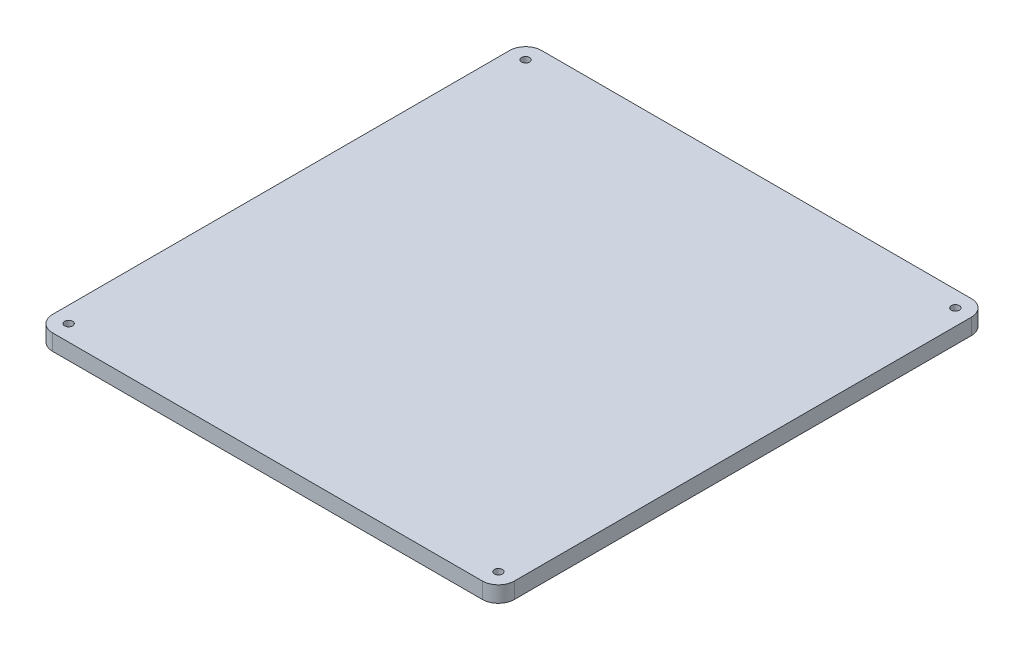
ISO-10303-21;
HEADER;
FILE_DESCRIPTION(('STEP AP214'),'2;1');
FILE_NAME('part.step','',(''),(''),'','','');
FILE_SCHEMA(('AUTOMOTIVE_DESIGN { 1 0 10303 214 1 1 1 1 }'));
ENDSEC;
DATA;
#1=APPLICATION_CONTEXT('core data for automotive mechanical design processes');
#2=APPLICATION_PROTOCOL_DEFINITION('international standard','automotive_design',2000,#1);
#3=PRODUCT_CONTEXT('',#1,'mechanical');
#4=PRODUCT('Part','Part','',(#3));
#5=PRODUCT_RELATED_PRODUCT_CATEGORY('part','',(#4));
#6=PRODUCT_DEFINITION_FORMATION('','',#4);
#7=PRODUCT_DEFINITION_CONTEXT('part definition',#1,'design');
#8=PRODUCT_DEFINITION('design','',#6,#7);
#9=PRODUCT_DEFINITION_SHAPE('','',#8);
#10=(LENGTH_UNIT() NAMED_UNIT(*) SI_UNIT(.MILLI.,.METRE.));
#11=(NAMED_UNIT(*) PLANE_ANGLE_UNIT() SI_UNIT($,.RADIAN.));
#12=(NAMED_UNIT(*) SI_UNIT($,.STERADIAN.) SOLID_ANGLE_UNIT());
#13=UNCERTAINTY_MEASURE_WITH_UNIT(LENGTH_MEASURE(1.E-05),#10,'distance_accuracy_value','');
#14=(GEOMETRIC_REPRESENTATION_CONTEXT(3) GLOBAL_UNCERTAINTY_ASSIGNED_CONTEXT((#13)) GLOBAL_UNIT_ASSIGNED_CONTEXT((#10,
#11,#12)) REPRESENTATION_CONTEXT('',''));
#15=CARTESIAN_POINT('',(0.,0.,0.));
#16=DIRECTION('',(0.,0.,1.));
#17=DIRECTION('',(1.,0.,0.));
#18=AXIS2_PLACEMENT_3D('',#15,#16,#17);
#19=CARTESIAN_POINT('',(0.,10.,0.));
#20=DIRECTION('',(0.,1.,0.));
#21=DIRECTION('',(0.,0.,1.));
#22=AXIS2_PLACEMENT_3D('',#19,#20,#21);
#23=PLANE('',#22);
#24=CARTESIAN_POINT('',(212.300909569802,10.,238.344317293603));
#25=DIRECTION('',(0.,1.,0.));
#26=DIRECTION('',(0.,0.,1.));
#27=AXIS2_PLACEMENT_3D('',#24,#25,#26);
#28=CIRCLE('',#27,2.4999999999989);
#29=CARTESIAN_POINT('',(212.300909569802,10.,240.844317293601));
#30=VERTEX_POINT('',#29);
#31=EDGE_CURVE('E186',#30,#30,#28,.T.);
#32=ORIENTED_EDGE('',*,*,#31,.F.);
#33=EDGE_LOOP('',(#32));
#34=FACE_BOUND('',#33,.T.);
#35=CARTESIAN_POINT('',(-55.6990904301984,10.,-46.6556827063974));
#36=DIRECTION('',(0.,1.,0.));
#37=DIRECTION('',(0.,0.,1.));
#38=AXIS2_PLACEMENT_3D('',#35,#36,#37);
#39=CIRCLE('',#38,2.50000000002064);
#40=CARTESIAN_POINT('',(-55.6990904301984,10.,-44.1556827063768));
#41=VERTEX_POINT('',#40);
#42=EDGE_CURVE('E132',#41,#41,#39,.T.);
#43=ORIENTED_EDGE('',*,*,#42,.F.);
#44=EDGE_LOOP('',(#43));
#45=FACE_BOUND('',#44,.T.);
#46=DIRECTION('',(0.,0.,1.));
#47=VECTOR('',#46,1.);
#48=CARTESIAN_POINT('',(-65.6990904301984,10.,-56.6556827063974));
#49=LINE('',#48,#47);
#50=CARTESIAN_POINT('',(-65.6990904301984,10.,-46.6556827063974));
#51=VERTEX_POINT('',#50);
#52=CARTESIAN_POINT('',(-65.6990904301984,10.,238.344317293603));
#53=VERTEX_POINT('',#52);
#54=EDGE_CURVE('E137',#51,#53,#49,.T.);
#55=ORIENTED_EDGE('',*,*,#54,.T.);
#56=CARTESIAN_POINT('',(-55.6990904301984,10.,238.344317293604));
#57=DIRECTION('',(0.,1.,0.));
#58=DIRECTION('',(0.,0.,1.));
#59=AXIS2_PLACEMENT_3D('',#56,#57,#58);
#60=CIRCLE('',#59,10.);
#61=CARTESIAN_POINT('',(-55.6990904301984,10.,248.344317293604));
#62=VERTEX_POINT('',#61);
#63=EDGE_CURVE('E152',#53,#62,#60,.T.);
#64=ORIENTED_EDGE('',*,*,#63,.T.);
#65=DIRECTION('',(1.,0.,0.));
#66=VECTOR('',#65,1.);
#67=CARTESIAN_POINT('',(-65.6990904301984,10.,248.344317293604));
#68=LINE('',#67,#66);
#69=CARTESIAN_POINT('',(212.300909569802,10.,248.344317293603));
#70=VERTEX_POINT('',#69);
#71=EDGE_CURVE('E119',#62,#70,#68,.T.);
#72=ORIENTED_EDGE('',*,*,#71,.T.);
#73=CARTESIAN_POINT('',(212.300909569802,10.,238.344317293603));
#74=DIRECTION('',(0.,1.,0.));
#75=DIRECTION('',(0.,0.,1.));
#76=AXIS2_PLACEMENT_3D('',#73,#74,#75);
#77=CIRCLE('',#76,10.);
#78=CARTESIAN_POINT('',(222.300909569802,10.,238.344317293603));
#79=VERTEX_POINT('',#78);
#80=EDGE_CURVE('E150',#70,#79,#77,.T.);
#81=ORIENTED_EDGE('',*,*,#80,.T.);
#82=DIRECTION('',(0.,0.,-1.));
#83=VECTOR('',#82,1.);
#84=CARTESIAN_POINT('',(222.300909569802,10.,-56.6556827063974));
#85=LINE('',#84,#83);
#86=CARTESIAN_POINT('',(222.300909569802,10.,-46.6556827063974));
#87=VERTEX_POINT('',#86);
#88=EDGE_CURVE('E163',#79,#87,#85,.T.);
#89=ORIENTED_EDGE('',*,*,#88,.T.);
#90=CARTESIAN_POINT('',(212.300909569802,10.,-46.6556827063974));
#91=DIRECTION('',(0.,1.,0.));
#92=DIRECTION('',(0.,0.,1.));
#93=AXIS2_PLACEMENT_3D('',#90,#91,#92);
#94=CIRCLE('',#93,10.);
#95=CARTESIAN_POINT('',(212.300909569802,10.,-56.6556827063974));
#96=VERTEX_POINT('',#95);
#97=EDGE_CURVE('E54',#87,#96,#94,.T.);
#98=ORIENTED_EDGE('',*,*,#97,.T.);
#99=DIRECTION('',(-1.,0.,0.));
#100=VECTOR('',#99,1.);
#101=CARTESIAN_POINT('',(-65.6990904301984,10.,-56.6556827063974));
#102=LINE('',#101,#100);
#103=CARTESIAN_POINT('',(-55.6990904301984,10.,-56.6556827063974));
#104=VERTEX_POINT('',#103);
#105=EDGE_CURVE('E138',#96,#104,#102,.T.);
#106=ORIENTED_EDGE('',*,*,#105,.T.);
#107=CARTESIAN_POINT('',(-55.6990904301984,10.,-46.6556827063974));
#108=DIRECTION('',(0.,1.,0.));
#109=DIRECTION('',(0.,0.,1.));
#110=AXIS2_PLACEMENT_3D('',#107,#108,#109);
#111=CIRCLE('',#110,10.);
#112=EDGE_CURVE('E147',#104,#51,#111,.T.);
#113=ORIENTED_EDGE('',*,*,#112,.T.);
#114=EDGE_LOOP('',(#55,#64,#72,#81,#89,#98,#106,#113));
#115=FACE_BOUND('',#114,.T.);
#116=CARTESIAN_POINT('',(212.300909569802,10.,-46.6556827063974));
#117=DIRECTION('',(0.,1.,0.));
#118=DIRECTION('',(0.,0.,-1.));
#119=AXIS2_PLACEMENT_3D('',#116,#117,#118);
#120=CIRCLE('',#119,2.50000000002066);
#121=CARTESIAN_POINT('',(212.300909569802,10.,-49.1556827064181));
#122=VERTEX_POINT('',#121);
#123=EDGE_CURVE('E180',#122,#122,#120,.T.);
#124=ORIENTED_EDGE('',*,*,#123,.F.);
#125=EDGE_LOOP('',(#124));
#126=FACE_BOUND('',#125,.T.);
#127=CARTESIAN_POINT('',(-55.6990904301984,10.,238.344317293603));
#128=DIRECTION('',(0.,1.,0.));
#129=DIRECTION('',(0.,0.,-1.));
#130=AXIS2_PLACEMENT_3D('',#127,#128,#129);
#131=CIRCLE('',#130,2.49999999999888);
#132=CARTESIAN_POINT('',(-55.6990904301984,10.,235.844317293604));
#133=VERTEX_POINT('',#132);
#134=EDGE_CURVE('E192',#133,#133,#131,.T.);
#135=ORIENTED_EDGE('',*,*,#134,.F.);
#136=EDGE_LOOP('',(#135));
#137=FACE_BOUND('',#136,.T.);
#138=ADVANCED_FACE('F33',(#34,#45,#115,#126,#137),#23,.T.);
#139=CARTESIAN_POINT('',(0.,0.,0.));
#140=DIRECTION('',(0.,1.,0.));
#141=DIRECTION('',(0.,0.,1.));
#142=AXIS2_PLACEMENT_3D('',#139,#140,#141);
#143=PLANE('',#142);
#144=DIRECTION('',(1.,0.,0.));
#145=VECTOR('',#144,1.);
#146=CARTESIAN_POINT('',(-65.6990904301984,0.,248.344317293604));
#147=LINE('',#146,#145);
#148=CARTESIAN_POINT('',(-55.6990904301984,0.,248.344317293604));
#149=VERTEX_POINT('',#148);
#150=CARTESIAN_POINT('',(212.300909569802,0.,248.344317293603));
#151=VERTEX_POINT('',#150);
#152=EDGE_CURVE('E116',#149,#151,#147,.T.);
#153=ORIENTED_EDGE('',*,*,#152,.F.);
#154=CARTESIAN_POINT('',(-55.6990904301984,0.,238.344317293604));
#155=DIRECTION('',(0.,1.,0.));
#156=DIRECTION('',(0.,0.,1.));
#157=AXIS2_PLACEMENT_3D('',#154,#155,#156);
#158=CIRCLE('',#157,10.);
#159=CARTESIAN_POINT('',(-65.6990904301984,0.,238.344317293603));
#160=VERTEX_POINT('',#159);
#161=EDGE_CURVE('E99',#149,#160,#158,.F.);
#162=ORIENTED_EDGE('',*,*,#161,.T.);
#163=DIRECTION('',(0.,0.,1.));
#164=VECTOR('',#163,1.);
#165=CARTESIAN_POINT('',(-65.6990904301984,0.,-56.6556827063974));
#166=LINE('',#165,#164);
#167=CARTESIAN_POINT('',(-65.6990904301984,0.,-46.6556827063974));
#168=VERTEX_POINT('',#167);
#169=EDGE_CURVE('E127',#168,#160,#166,.T.);
#170=ORIENTED_EDGE('',*,*,#169,.F.);
#171=CARTESIAN_POINT('',(-55.6990904301984,0.,-46.6556827063974));
#172=DIRECTION('',(0.,1.,0.));
#173=DIRECTION('',(0.,0.,1.));
#174=AXIS2_PLACEMENT_3D('',#171,#172,#173);
#175=CIRCLE('',#174,10.);
#176=CARTESIAN_POINT('',(-55.6990904301984,0.,-56.6556827063974));
#177=VERTEX_POINT('',#176);
#178=EDGE_CURVE('E120',#168,#177,#175,.F.);
#179=ORIENTED_EDGE('',*,*,#178,.T.);
#180=DIRECTION('',(-1.,0.,0.));
#181=VECTOR('',#180,1.);
#182=CARTESIAN_POINT('',(-65.6990904301984,0.,-56.6556827063974));
#183=LINE('',#182,#181);
#184=CARTESIAN_POINT('',(212.300909569802,0.,-56.6556827063974));
#185=VERTEX_POINT('',#184);
#186=EDGE_CURVE('E130',#185,#177,#183,.T.);
#187=ORIENTED_EDGE('',*,*,#186,.F.);
#188=CARTESIAN_POINT('',(212.300909569802,0.,-46.6556827063974));
#189=DIRECTION('',(0.,1.,0.));
#190=DIRECTION('',(0.,0.,1.));
#191=AXIS2_PLACEMENT_3D('',#188,#189,#190);
#192=CIRCLE('',#191,10.);
#193=CARTESIAN_POINT('',(222.300909569802,0.,-46.6556827063974));
#194=VERTEX_POINT('',#193);
#195=EDGE_CURVE('E141',#185,#194,#192,.F.);
#196=ORIENTED_EDGE('',*,*,#195,.T.);
#197=DIRECTION('',(0.,0.,-1.));
#198=VECTOR('',#197,1.);
#199=CARTESIAN_POINT('',(222.300909569802,0.,-56.6556827063974));
#200=LINE('',#199,#198);
#201=CARTESIAN_POINT('',(222.300909569802,0.,238.344317293603));
#202=VERTEX_POINT('',#201);
#203=EDGE_CURVE('E126',#202,#194,#200,.T.);
#204=ORIENTED_EDGE('',*,*,#203,.F.);
#205=CARTESIAN_POINT('',(212.300909569802,0.,238.344317293603));
#206=DIRECTION('',(0.,1.,0.));
#207=DIRECTION('',(0.,0.,1.));
#208=AXIS2_PLACEMENT_3D('',#205,#206,#207);
#209=CIRCLE('',#208,10.);
#210=EDGE_CURVE('E110',#202,#151,#209,.F.);
#211=ORIENTED_EDGE('',*,*,#210,.T.);
#212=EDGE_LOOP('',(#153,#162,#170,#179,#187,#196,#204,#211));
#213=FACE_BOUND('',#212,.T.);
#214=CARTESIAN_POINT('',(-55.6990904301984,0.,-46.6556827063974));
#215=DIRECTION('',(0.,1.,0.));
#216=DIRECTION('',(0.,0.,1.));
#217=AXIS2_PLACEMENT_3D('',#214,#215,#216);
#218=CIRCLE('',#217,2.50000000002064);
#219=CARTESIAN_POINT('',(-55.6990904301984,0.,-44.1556827063768));
#220=VERTEX_POINT('',#219);
#221=EDGE_CURVE('E177',#220,#220,#218,.T.);
#222=ORIENTED_EDGE('',*,*,#221,.T.);
#223=EDGE_LOOP('',(#222));
#224=FACE_BOUND('',#223,.T.);
#225=CARTESIAN_POINT('',(212.300909569802,0.,-46.6556827063974));
#226=DIRECTION('',(0.,1.,0.));
#227=DIRECTION('',(0.,0.,-1.));
#228=AXIS2_PLACEMENT_3D('',#225,#226,#227);
#229=CIRCLE('',#228,2.50000000002066);
#230=CARTESIAN_POINT('',(212.300909569802,0.,-49.1556827064181));
#231=VERTEX_POINT('',#230);
#232=EDGE_CURVE('E183',#231,#231,#229,.T.);
#233=ORIENTED_EDGE('',*,*,#232,.T.);
#234=EDGE_LOOP('',(#233));
#235=FACE_BOUND('',#234,.T.);
#236=CARTESIAN_POINT('',(212.300909569802,0.,238.344317293603));
#237=DIRECTION('',(0.,1.,0.));
#238=DIRECTION('',(0.,0.,1.));
#239=AXIS2_PLACEMENT_3D('',#236,#237,#238);
#240=CIRCLE('',#239,2.4999999999989);
#241=CARTESIAN_POINT('',(212.300909569802,0.,240.844317293601));
#242=VERTEX_POINT('',#241);
#243=EDGE_CURVE('E189',#242,#242,#240,.T.);
#244=ORIENTED_EDGE('',*,*,#243,.T.);
#245=EDGE_LOOP('',(#244));
#246=FACE_BOUND('',#245,.T.);
#247=CARTESIAN_POINT('',(-55.6990904301984,0.,238.344317293603));
#248=DIRECTION('',(0.,1.,0.));
#249=DIRECTION('',(0.,0.,-1.));
#250=AXIS2_PLACEMENT_3D('',#247,#248,#249);
#251=CIRCLE('',#250,2.49999999999888);
#252=CARTESIAN_POINT('',(-55.6990904301984,0.,235.844317293604));
#253=VERTEX_POINT('',#252);
#254=EDGE_CURVE('E195',#253,#253,#251,.T.);
#255=ORIENTED_EDGE('',*,*,#254,.T.);
#256=EDGE_LOOP('',(#255));
#257=FACE_BOUND('',#256,.T.);
#258=ADVANCED_FACE('F123',(#213,#224,#235,#246,#257),#143,.F.);
#259=CARTESIAN_POINT('',(-65.6990904301984,10.,-56.6556827063974));
#260=DIRECTION('',(1.,0.,0.));
#261=DIRECTION('',(0.,0.,-1.));
#262=AXIS2_PLACEMENT_3D('',#259,#260,#261);
#263=PLANE('',#262);
#264=ORIENTED_EDGE('',*,*,#169,.T.);
#265=DIRECTION('',(0.,-1.,0.));
#266=VECTOR('',#265,1.);
#267=CARTESIAN_POINT('',(-65.6990904301984,10.,238.344317293603));
#268=LINE('',#267,#266);
#269=EDGE_CURVE('E104',#160,#53,#268,.F.);
#270=ORIENTED_EDGE('',*,*,#269,.T.);
#271=ORIENTED_EDGE('',*,*,#54,.F.);
#272=DIRECTION('',(0.,-1.,0.));
#273=VECTOR('',#272,1.);
#274=CARTESIAN_POINT('',(-65.6990904301984,10.,-46.6556827063974));
#275=LINE('',#274,#273);
#276=EDGE_CURVE('E109',#51,#168,#275,.T.);
#277=ORIENTED_EDGE('',*,*,#276,.T.);
#278=EDGE_LOOP('',(#264,#270,#271,#277));
#279=FACE_BOUND('',#278,.T.);
#280=ADVANCED_FACE('F211',(#279),#263,.F.);
#281=CARTESIAN_POINT('',(-65.6990904301984,10.,248.344317293604));
#282=DIRECTION('',(0.,0.,-1.));
#283=DIRECTION('',(-1.,0.,0.));
#284=AXIS2_PLACEMENT_3D('',#281,#282,#283);
#285=PLANE('',#284);
#286=ORIENTED_EDGE('',*,*,#71,.F.);
#287=DIRECTION('',(0.,-1.,0.));
#288=VECTOR('',#287,1.);
#289=CARTESIAN_POINT('',(-55.6990904301984,10.,248.344317293604));
#290=LINE('',#289,#288);
#291=EDGE_CURVE('E103',#62,#149,#290,.T.);
#292=ORIENTED_EDGE('',*,*,#291,.T.);
#293=ORIENTED_EDGE('',*,*,#152,.T.);
#294=DIRECTION('',(0.,-1.,0.));
#295=VECTOR('',#294,1.);
#296=CARTESIAN_POINT('',(212.300909569802,10.,248.344317293603));
#297=LINE('',#296,#295);
#298=EDGE_CURVE('E121',#151,#70,#297,.F.);
#299=ORIENTED_EDGE('',*,*,#298,.T.);
#300=EDGE_LOOP('',(#286,#292,#293,#299));
#301=FACE_BOUND('',#300,.T.);
#302=ADVANCED_FACE('F115',(#301),#285,.F.);
#303=CARTESIAN_POINT('',(222.300909569802,10.,-56.6556827063974));
#304=DIRECTION('',(-1.,0.,0.));
#305=DIRECTION('',(0.,0.,1.));
#306=AXIS2_PLACEMENT_3D('',#303,#304,#305);
#307=PLANE('',#306);
#308=ORIENTED_EDGE('',*,*,#88,.F.);
#309=DIRECTION('',(0.,-1.,0.));
#310=VECTOR('',#309,1.);
#311=CARTESIAN_POINT('',(222.300909569802,10.,238.344317293603));
#312=LINE('',#311,#310);
#313=EDGE_CURVE('E156',#79,#202,#312,.T.);
#314=ORIENTED_EDGE('',*,*,#313,.T.);
#315=ORIENTED_EDGE('',*,*,#203,.T.);
#316=DIRECTION('',(0.,-1.,0.));
#317=VECTOR('',#316,1.);
#318=CARTESIAN_POINT('',(222.300909569802,10.,-46.6556827063974));
#319=LINE('',#318,#317);
#320=EDGE_CURVE('E154',#194,#87,#319,.F.);
#321=ORIENTED_EDGE('',*,*,#320,.T.);
#322=EDGE_LOOP('',(#308,#314,#315,#321));
#323=FACE_BOUND('',#322,.T.);
#324=ADVANCED_FACE('F161',(#323),#307,.F.);
#325=CARTESIAN_POINT('',(-65.6990904301984,10.,-56.6556827063974));
#326=DIRECTION('',(0.,0.,1.));
#327=DIRECTION('',(1.,0.,0.));
#328=AXIS2_PLACEMENT_3D('',#325,#326,#327);
#329=PLANE('',#328);
#330=ORIENTED_EDGE('',*,*,#105,.F.);
#331=DIRECTION('',(0.,-1.,0.));
#332=VECTOR('',#331,1.);
#333=CARTESIAN_POINT('',(212.300909569802,10.,-56.6556827063974));
#334=LINE('',#333,#332);
#335=EDGE_CURVE('E11',#96,#185,#334,.T.);
#336=ORIENTED_EDGE('',*,*,#335,.T.);
#337=ORIENTED_EDGE('',*,*,#186,.T.);
#338=DIRECTION('',(0.,-1.,0.));
#339=VECTOR('',#338,1.);
#340=CARTESIAN_POINT('',(-55.6990904301984,10.,-56.6556827063974));
#341=LINE('',#340,#339);
#342=EDGE_CURVE('E41',#177,#104,#341,.F.);
#343=ORIENTED_EDGE('',*,*,#342,.T.);
#344=EDGE_LOOP('',(#330,#336,#337,#343));
#345=FACE_BOUND('',#344,.T.);
#346=ADVANCED_FACE('F170',(#345),#329,.F.);
#347=CARTESIAN_POINT('',(-55.6990904301984,10.,-46.6556827063974));
#348=DIRECTION('',(0.,-1.,0.));
#349=DIRECTION('',(0.,0.,-1.));
#350=AXIS2_PLACEMENT_3D('',#347,#348,#349);
#351=CYLINDRICAL_SURFACE('',#350,2.50000000002064);
#352=ORIENTED_EDGE('',*,*,#42,.T.);
#353=EDGE_LOOP('',(#352));
#354=FACE_BOUND('',#353,.T.);
#355=ORIENTED_EDGE('',*,*,#221,.F.);
#356=EDGE_LOOP('',(#355));
#357=FACE_BOUND('',#356,.T.);
#358=ADVANCED_FACE('F216',(#354,#357),#351,.F.);
#359=CARTESIAN_POINT('',(212.300909569802,10.,-46.6556827063974));
#360=DIRECTION('',(0.,-1.,0.));
#361=DIRECTION('',(0.,0.,-1.));
#362=AXIS2_PLACEMENT_3D('',#359,#360,#361);
#363=CYLINDRICAL_SURFACE('',#362,2.50000000002066);
#364=ORIENTED_EDGE('',*,*,#123,.T.);
#365=EDGE_LOOP('',(#364));
#366=FACE_BOUND('',#365,.T.);
#367=ORIENTED_EDGE('',*,*,#232,.F.);
#368=EDGE_LOOP('',(#367));
#369=FACE_BOUND('',#368,.T.);
#370=ADVANCED_FACE('F244',(#366,#369),#363,.F.);
#371=CARTESIAN_POINT('',(212.300909569802,10.,238.344317293603));
#372=DIRECTION('',(0.,-1.,0.));
#373=DIRECTION('',(0.,0.,-1.));
#374=AXIS2_PLACEMENT_3D('',#371,#372,#373);
#375=CYLINDRICAL_SURFACE('',#374,2.4999999999989);
#376=ORIENTED_EDGE('',*,*,#31,.T.);
#377=EDGE_LOOP('',(#376));
#378=FACE_BOUND('',#377,.T.);
#379=ORIENTED_EDGE('',*,*,#243,.F.);
#380=EDGE_LOOP('',(#379));
#381=FACE_BOUND('',#380,.T.);
#382=ADVANCED_FACE('F247',(#378,#381),#375,.F.);
#383=CARTESIAN_POINT('',(-55.6990904301984,10.,238.344317293603));
#384=DIRECTION('',(0.,-1.,0.));
#385=DIRECTION('',(0.,0.,-1.));
#386=AXIS2_PLACEMENT_3D('',#383,#384,#385);
#387=CYLINDRICAL_SURFACE('',#386,2.49999999999888);
#388=ORIENTED_EDGE('',*,*,#134,.T.);
#389=EDGE_LOOP('',(#388));
#390=FACE_BOUND('',#389,.T.);
#391=ORIENTED_EDGE('',*,*,#254,.F.);
#392=EDGE_LOOP('',(#391));
#393=FACE_BOUND('',#392,.T.);
#394=ADVANCED_FACE('F201',(#390,#393),#387,.F.);
#395=CARTESIAN_POINT('',(-55.6990904301984,10.,238.344317293604));
#396=DIRECTION('',(0.,-1.,0.));
#397=DIRECTION('',(0.,0.,-1.));
#398=AXIS2_PLACEMENT_3D('',#395,#396,#397);
#399=CYLINDRICAL_SURFACE('',#398,10.);
#400=ORIENTED_EDGE('',*,*,#63,.F.);
#401=ORIENTED_EDGE('',*,*,#269,.F.);
#402=ORIENTED_EDGE('',*,*,#161,.F.);
#403=ORIENTED_EDGE('',*,*,#291,.F.);
#404=EDGE_LOOP('',(#400,#401,#402,#403));
#405=FACE_BOUND('',#404,.T.);
#406=ADVANCED_FACE('F102',(#405),#399,.T.);
#407=CARTESIAN_POINT('',(212.300909569802,10.,238.344317293603));
#408=DIRECTION('',(0.,-1.,0.));
#409=DIRECTION('',(0.,0.,-1.));
#410=AXIS2_PLACEMENT_3D('',#407,#408,#409);
#411=CYLINDRICAL_SURFACE('',#410,10.);
#412=ORIENTED_EDGE('',*,*,#80,.F.);
#413=ORIENTED_EDGE('',*,*,#298,.F.);
#414=ORIENTED_EDGE('',*,*,#210,.F.);
#415=ORIENTED_EDGE('',*,*,#313,.F.);
#416=EDGE_LOOP('',(#412,#413,#414,#415));
#417=FACE_BOUND('',#416,.T.);
#418=ADVANCED_FACE('F230',(#417),#411,.T.);
#419=CARTESIAN_POINT('',(212.300909569802,10.,-46.6556827063974));
#420=DIRECTION('',(0.,-1.,0.));
#421=DIRECTION('',(0.,0.,-1.));
#422=AXIS2_PLACEMENT_3D('',#419,#420,#421);
#423=CYLINDRICAL_SURFACE('',#422,10.);
#424=ORIENTED_EDGE('',*,*,#97,.F.);
#425=ORIENTED_EDGE('',*,*,#320,.F.);
#426=ORIENTED_EDGE('',*,*,#195,.F.);
#427=ORIENTED_EDGE('',*,*,#335,.F.);
#428=EDGE_LOOP('',(#424,#425,#426,#427));
#429=FACE_BOUND('',#428,.T.);
#430=ADVANCED_FACE('F169',(#429),#423,.T.);
#431=CARTESIAN_POINT('',(-55.6990904301984,10.,-46.6556827063974));
#432=DIRECTION('',(0.,-1.,0.));
#433=DIRECTION('',(0.,0.,-1.));
#434=AXIS2_PLACEMENT_3D('',#431,#432,#433);
#435=CYLINDRICAL_SURFACE('',#434,10.);
#436=ORIENTED_EDGE('',*,*,#112,.F.);
#437=ORIENTED_EDGE('',*,*,#342,.F.);
#438=ORIENTED_EDGE('',*,*,#178,.F.);
#439=ORIENTED_EDGE('',*,*,#276,.F.);
#440=EDGE_LOOP('',(#436,#437,#438,#439));
#441=FACE_BOUND('',#440,.T.);
#442=ADVANCED_FACE('F35',(#441),#435,.T.);
#443=CLOSED_SHELL('',(#138,#258,#280,#302,#324,#346,#358,#370,#382,#394,#406,#418,#430,#442));
#444=MANIFOLD_SOLID_BREP('B2',#443);
#445=ADVANCED_BREP_SHAPE_REPRESENTATION('',(#18,#444),#14);
#446=SHAPE_DEFINITION_REPRESENTATION(#9,#445);
ENDSEC;
END-ISO-10303-21;
